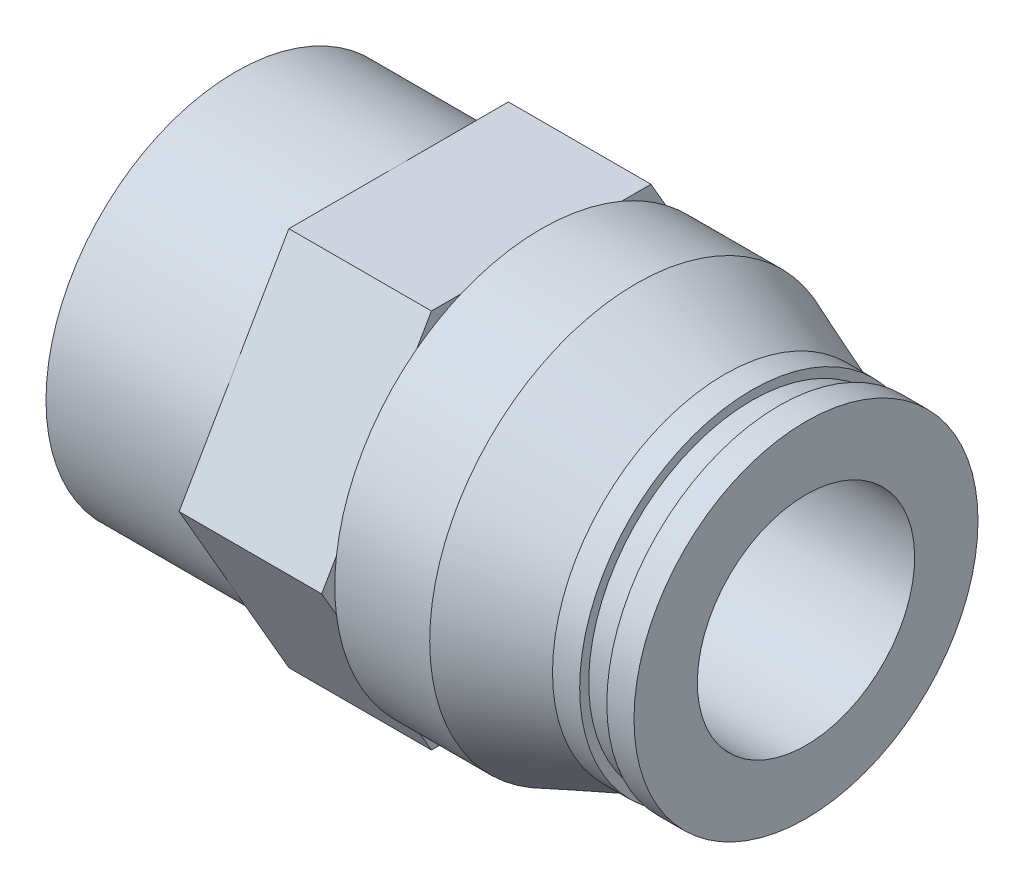
ISO-10303-21;
HEADER;
FILE_DESCRIPTION(('STEP AP214'),'2;1');
FILE_NAME('part.step','',(''),(''),'','','');
FILE_SCHEMA(('AUTOMOTIVE_DESIGN { 1 0 10303 214 1 1 1 1 }'));
ENDSEC;
DATA;
#1=APPLICATION_CONTEXT('core data for automotive mechanical design processes');
#2=APPLICATION_PROTOCOL_DEFINITION('international standard','automotive_design',2000,#1);
#3=PRODUCT_CONTEXT('',#1,'mechanical');
#4=PRODUCT('Part','Part','',(#3));
#5=PRODUCT_RELATED_PRODUCT_CATEGORY('part','',(#4));
#6=PRODUCT_DEFINITION_FORMATION('','',#4);
#7=PRODUCT_DEFINITION_CONTEXT('part definition',#1,'design');
#8=PRODUCT_DEFINITION('design','',#6,#7);
#9=PRODUCT_DEFINITION_SHAPE('','',#8);
#10=(LENGTH_UNIT() NAMED_UNIT(*) SI_UNIT(.MILLI.,.METRE.));
#11=(NAMED_UNIT(*) PLANE_ANGLE_UNIT() SI_UNIT($,.RADIAN.));
#12=(NAMED_UNIT(*) SI_UNIT($,.STERADIAN.) SOLID_ANGLE_UNIT());
#13=UNCERTAINTY_MEASURE_WITH_UNIT(LENGTH_MEASURE(1.E-05),#10,'distance_accuracy_value','');
#14=(GEOMETRIC_REPRESENTATION_CONTEXT(3) GLOBAL_UNCERTAINTY_ASSIGNED_CONTEXT((#13)) GLOBAL_UNIT_ASSIGNED_CONTEXT((#10,
#11,#12)) REPRESENTATION_CONTEXT('',''));
#15=CARTESIAN_POINT('',(0.,0.,0.));
#16=DIRECTION('',(0.,0.,1.));
#17=DIRECTION('',(1.,0.,0.));
#18=AXIS2_PLACEMENT_3D('',#15,#16,#17);
#19=CARTESIAN_POINT('',(16.875,12.5,0.));
#20=DIRECTION('',(1.,0.,0.));
#21=DIRECTION('',(0.,1.,0.));
#22=AXIS2_PLACEMENT_3D('',#19,#20,#21);
#23=PLANE('',#22);
#24=DIRECTION('',(0.,0.,1.));
#25=VECTOR('',#24,1.);
#26=CARTESIAN_POINT('',(16.875,-10.5,0.));
#27=LINE('',#26,#25);
#28=CARTESIAN_POINT('',(16.875,-10.5,6.06217782649104));
#29=VERTEX_POINT('',#28);
#30=CARTESIAN_POINT('',(16.875,-10.5,4.43299528280811));
#31=VERTEX_POINT('',#30);
#32=EDGE_CURVE('E136',#29,#31,#27,.F.);
#33=ORIENTED_EDGE('',*,*,#32,.T.);
#34=CARTESIAN_POINT('',(16.875,0.,0.));
#35=DIRECTION('',(1.,0.,0.));
#36=DIRECTION('',(0.,1.,0.));
#37=AXIS2_PLACEMENT_3D('',#34,#35,#36);
#38=CIRCLE('',#37,11.3974316044186);
#39=CARTESIAN_POINT('',(16.875,-9.08908652976844,6.87676909833253));
#40=VERTEX_POINT('',#39);
#41=EDGE_CURVE('E17',#40,#31,#38,.T.);
#42=ORIENTED_EDGE('',*,*,#41,.F.);
#43=DIRECTION('',(0.,-0.866025403784436,-0.500000000000005));
#44=VECTOR('',#43,1.);
#45=CARTESIAN_POINT('',(16.875,-9.08908652976842,6.87676909833254));
#46=LINE('',#45,#44);
#47=EDGE_CURVE('E139',#40,#29,#46,.T.);
#48=ORIENTED_EDGE('',*,*,#47,.T.);
#49=EDGE_LOOP('',(#33,#42,#48));
#50=FACE_BOUND('',#49,.T.);
#51=ADVANCED_FACE('F14',(#50),#23,.T.);
#52=CARTESIAN_POINT('',(16.875,12.5,0.));
#53=DIRECTION('',(1.,0.,0.));
#54=DIRECTION('',(0.,1.,0.));
#55=AXIS2_PLACEMENT_3D('',#52,#53,#54);
#56=PLANE('',#55);
#57=DIRECTION('',(0.,0.,1.));
#58=VECTOR('',#57,1.);
#59=CARTESIAN_POINT('',(16.875,-10.5,0.));
#60=LINE('',#59,#58);
#61=CARTESIAN_POINT('',(16.875,-10.5,-4.43299528280812));
#62=VERTEX_POINT('',#61);
#63=CARTESIAN_POINT('',(16.875,-10.5,-6.06217782649111));
#64=VERTEX_POINT('',#63);
#65=EDGE_CURVE('E144',#62,#64,#60,.F.);
#66=ORIENTED_EDGE('',*,*,#65,.T.);
#67=DIRECTION('',(0.,0.866025403784436,-0.500000000000004));
#68=VECTOR('',#67,1.);
#69=CARTESIAN_POINT('',(16.875,-10.5,-6.0621778264911));
#70=LINE('',#69,#68);
#71=CARTESIAN_POINT('',(16.875,-9.08908652976841,-6.87676909833259));
#72=VERTEX_POINT('',#71);
#73=EDGE_CURVE('E202',#64,#72,#70,.T.);
#74=ORIENTED_EDGE('',*,*,#73,.T.);
#75=CARTESIAN_POINT('',(16.875,0.,0.));
#76=DIRECTION('',(1.,0.,0.));
#77=DIRECTION('',(0.,1.,0.));
#78=AXIS2_PLACEMENT_3D('',#75,#76,#77);
#79=CIRCLE('',#78,11.3974316044186);
#80=EDGE_CURVE('E158',#62,#72,#79,.T.);
#81=ORIENTED_EDGE('',*,*,#80,.F.);
#82=EDGE_LOOP('',(#66,#74,#81));
#83=FACE_BOUND('',#82,.T.);
#84=ADVANCED_FACE('F479',(#83),#56,.T.);
#85=CARTESIAN_POINT('',(16.875,12.5,0.));
#86=DIRECTION('',(1.,0.,0.));
#87=DIRECTION('',(0.,1.,0.));
#88=AXIS2_PLACEMENT_3D('',#85,#86,#87);
#89=PLANE('',#88);
#90=DIRECTION('',(0.,0.866025403784436,0.500000000000004));
#91=VECTOR('',#90,1.);
#92=CARTESIAN_POINT('',(16.875,9.08908652976843,-6.87676909833254));
#93=LINE('',#92,#91);
#94=CARTESIAN_POINT('',(16.875,9.08908652976842,-6.87676909833254));
#95=VERTEX_POINT('',#94);
#96=CARTESIAN_POINT('',(16.875,10.5,-6.06217782649107));
#97=VERTEX_POINT('',#96);
#98=EDGE_CURVE('E198',#95,#97,#93,.T.);
#99=ORIENTED_EDGE('',*,*,#98,.T.);
#100=DIRECTION('',(0.,0.,1.));
#101=VECTOR('',#100,1.);
#102=CARTESIAN_POINT('',(16.875,10.5,0.));
#103=LINE('',#102,#101);
#104=CARTESIAN_POINT('',(16.875,10.5,-4.43299528280816));
#105=VERTEX_POINT('',#104);
#106=EDGE_CURVE('E194',#97,#105,#103,.T.);
#107=ORIENTED_EDGE('',*,*,#106,.T.);
#108=CARTESIAN_POINT('',(16.875,0.,0.));
#109=DIRECTION('',(1.,0.,0.));
#110=DIRECTION('',(0.,1.,0.));
#111=AXIS2_PLACEMENT_3D('',#108,#109,#110);
#112=CIRCLE('',#111,11.3974316044186);
#113=EDGE_CURVE('E277',#95,#105,#112,.T.);
#114=ORIENTED_EDGE('',*,*,#113,.F.);
#115=EDGE_LOOP('',(#99,#107,#114));
#116=FACE_BOUND('',#115,.T.);
#117=ADVANCED_FACE('F473',(#116),#89,.T.);
#118=CARTESIAN_POINT('',(16.875,12.5,0.));
#119=DIRECTION('',(1.,0.,0.));
#120=DIRECTION('',(0.,1.,0.));
#121=AXIS2_PLACEMENT_3D('',#118,#119,#120);
#122=PLANE('',#121);
#123=DIRECTION('',(0.,0.,1.));
#124=VECTOR('',#123,1.);
#125=CARTESIAN_POINT('',(16.875,10.5,0.));
#126=LINE('',#125,#124);
#127=CARTESIAN_POINT('',(16.875,10.5,4.43299528280813));
#128=VERTEX_POINT('',#127);
#129=CARTESIAN_POINT('',(16.875,10.5,6.06217782649107));
#130=VERTEX_POINT('',#129);
#131=EDGE_CURVE('E190',#128,#130,#126,.T.);
#132=ORIENTED_EDGE('',*,*,#131,.T.);
#133=DIRECTION('',(0.,-0.866025403784441,0.499999999999996));
#134=VECTOR('',#133,1.);
#135=CARTESIAN_POINT('',(16.875,10.5,6.06217782649107));
#136=LINE('',#135,#134);
#137=CARTESIAN_POINT('',(16.875,9.08908652976844,6.87676909833251));
#138=VERTEX_POINT('',#137);
#139=EDGE_CURVE('E159',#130,#138,#136,.T.);
#140=ORIENTED_EDGE('',*,*,#139,.T.);
#141=CARTESIAN_POINT('',(16.875,0.,0.));
#142=DIRECTION('',(1.,0.,0.));
#143=DIRECTION('',(0.,1.,0.));
#144=AXIS2_PLACEMENT_3D('',#141,#142,#143);
#145=CIRCLE('',#144,11.3974316044186);
#146=EDGE_CURVE('E188',#128,#138,#145,.T.);
#147=ORIENTED_EDGE('',*,*,#146,.F.);
#148=EDGE_LOOP('',(#132,#140,#147));
#149=FACE_BOUND('',#148,.T.);
#150=ADVANCED_FACE('F468',(#149),#122,.T.);
#151=CARTESIAN_POINT('',(0.,0.,0.));
#152=DIRECTION('',(1.,0.,0.));
#153=DIRECTION('',(0.,1.,0.));
#154=AXIS2_PLACEMENT_3D('',#151,#152,#153);
#155=CYLINDRICAL_SURFACE('',#154,11.3974316044186);
#156=CARTESIAN_POINT('',(22.1152899601702,0.,0.));
#157=DIRECTION('',(-1.,0.,0.));
#158=DIRECTION('',(0.,0.,1.));
#159=AXIS2_PLACEMENT_3D('',#156,#157,#158);
#160=CIRCLE('',#159,11.3974316044186);
#161=CARTESIAN_POINT('',(22.1152899601702,0.,11.3974316044186));
#162=VERTEX_POINT('',#161);
#163=EDGE_CURVE('E185',#162,#162,#160,.F.);
#164=ORIENTED_EDGE('',*,*,#163,.F.);
#165=EDGE_LOOP('',(#164));
#166=FACE_BOUND('',#165,.T.);
#167=ORIENTED_EDGE('',*,*,#146,.T.);
#168=CARTESIAN_POINT('',(16.875,0.,0.));
#169=DIRECTION('',(1.,0.,0.));
#170=DIRECTION('',(0.,1.,0.));
#171=AXIS2_PLACEMENT_3D('',#168,#169,#170);
#172=CIRCLE('',#171,11.3974316044186);
#173=CARTESIAN_POINT('',(16.875,1.41091347023155,11.3097643811407));
#174=VERTEX_POINT('',#173);
#175=EDGE_CURVE('E268',#174,#138,#172,.F.);
#176=ORIENTED_EDGE('',*,*,#175,.F.);
#177=CARTESIAN_POINT('',(16.875,0.,0.));
#178=DIRECTION('',(1.,0.,0.));
#179=DIRECTION('',(0.,1.,0.));
#180=AXIS2_PLACEMENT_3D('',#177,#178,#179);
#181=CIRCLE('',#180,11.3974316044186);
#182=CARTESIAN_POINT('',(16.875,-1.41091347023155,11.3097643811407));
#183=VERTEX_POINT('',#182);
#184=EDGE_CURVE('E271',#183,#174,#181,.F.);
#185=ORIENTED_EDGE('',*,*,#184,.F.);
#186=CARTESIAN_POINT('',(16.875,0.,0.));
#187=DIRECTION('',(1.,0.,0.));
#188=DIRECTION('',(0.,1.,0.));
#189=AXIS2_PLACEMENT_3D('',#186,#187,#188);
#190=CIRCLE('',#189,11.3974316044186);
#191=EDGE_CURVE('E156',#40,#183,#190,.F.);
#192=ORIENTED_EDGE('',*,*,#191,.F.);
#193=ORIENTED_EDGE('',*,*,#41,.T.);
#194=CARTESIAN_POINT('',(16.875,0.,0.));
#195=DIRECTION('',(1.,0.,0.));
#196=DIRECTION('',(0.,1.,0.));
#197=AXIS2_PLACEMENT_3D('',#194,#195,#196);
#198=CIRCLE('',#197,11.3974316044186);
#199=EDGE_CURVE('E152',#62,#31,#198,.F.);
#200=ORIENTED_EDGE('',*,*,#199,.F.);
#201=ORIENTED_EDGE('',*,*,#80,.T.);
#202=CARTESIAN_POINT('',(16.875,0.,0.));
#203=DIRECTION('',(1.,0.,0.));
#204=DIRECTION('',(0.,1.,0.));
#205=AXIS2_PLACEMENT_3D('',#202,#203,#204);
#206=CIRCLE('',#205,11.3974316044186);
#207=CARTESIAN_POINT('',(16.875,-1.41091347023158,-11.3097643811407));
#208=VERTEX_POINT('',#207);
#209=EDGE_CURVE('E163',#208,#72,#206,.F.);
#210=ORIENTED_EDGE('',*,*,#209,.F.);
#211=CARTESIAN_POINT('',(16.875,0.,0.));
#212=DIRECTION('',(1.,0.,0.));
#213=DIRECTION('',(0.,1.,0.));
#214=AXIS2_PLACEMENT_3D('',#211,#212,#213);
#215=CIRCLE('',#214,11.3974316044186);
#216=CARTESIAN_POINT('',(16.875,1.41091347023157,-11.3097643811407));
#217=VERTEX_POINT('',#216);
#218=EDGE_CURVE('E280',#208,#217,#215,.T.);
#219=ORIENTED_EDGE('',*,*,#218,.T.);
#220=CARTESIAN_POINT('',(16.875,0.,0.));
#221=DIRECTION('',(1.,0.,0.));
#222=DIRECTION('',(0.,1.,0.));
#223=AXIS2_PLACEMENT_3D('',#220,#221,#222);
#224=CIRCLE('',#223,11.3974316044186);
#225=EDGE_CURVE('E184',#95,#217,#224,.F.);
#226=ORIENTED_EDGE('',*,*,#225,.F.);
#227=ORIENTED_EDGE('',*,*,#113,.T.);
#228=CARTESIAN_POINT('',(16.875,0.,0.));
#229=DIRECTION('',(1.,0.,0.));
#230=DIRECTION('',(0.,1.,0.));
#231=AXIS2_PLACEMENT_3D('',#228,#229,#230);
#232=CIRCLE('',#231,11.3974316044186);
#233=EDGE_CURVE('E265',#128,#105,#232,.F.);
#234=ORIENTED_EDGE('',*,*,#233,.F.);
#235=EDGE_LOOP('',(#167,#176,#185,#192,#193,#200,#201,#210,#219,#226,#227,#234));
#236=FACE_BOUND('',#235,.T.);
#237=ADVANCED_FACE('F150',(#166,#236),#155,.T.);
#238=CARTESIAN_POINT('',(22.1152899601702,0.,0.));
#239=DIRECTION('',(-1.,0.,0.));
#240=DIRECTION('',(0.,-1.,0.));
#241=AXIS2_PLACEMENT_3D('',#238,#239,#240);
#242=CONICAL_SURFACE('',#241,11.3974316044186,0.370503949260779);
#243=CARTESIAN_POINT('',(27.,0.,0.));
#244=DIRECTION('',(1.,0.,0.));
#245=DIRECTION('',(0.,1.,0.));
#246=AXIS2_PLACEMENT_3D('',#243,#244,#245);
#247=CIRCLE('',#246,9.5);
#248=CARTESIAN_POINT('',(27.,9.5,0.));
#249=VERTEX_POINT('',#248);
#250=EDGE_CURVE('E181',#249,#249,#247,.T.);
#251=ORIENTED_EDGE('',*,*,#250,.F.);
#252=EDGE_LOOP('',(#251));
#253=FACE_BOUND('',#252,.T.);
#254=ORIENTED_EDGE('',*,*,#163,.T.);
#255=EDGE_LOOP('',(#254));
#256=FACE_BOUND('',#255,.T.);
#257=ADVANCED_FACE('F461',(#253,#256),#242,.T.);
#258=CARTESIAN_POINT('',(16.875,0.,0.));
#259=DIRECTION('',(-1.,0.,0.));
#260=DIRECTION('',(0.,-1.,0.));
#261=AXIS2_PLACEMENT_3D('',#258,#259,#260);
#262=PLANE('',#261);
#263=DIRECTION('',(0.,0.866025403784439,-0.5));
#264=VECTOR('',#263,1.);
#265=CARTESIAN_POINT('',(16.875,0.,-12.1243556529821));
#266=LINE('',#265,#264);
#267=EDGE_CURVE('E173',#208,#72,#266,.F.);
#268=ORIENTED_EDGE('',*,*,#267,.F.);
#269=ORIENTED_EDGE('',*,*,#209,.T.);
#270=EDGE_LOOP('',(#268,#269));
#271=FACE_BOUND('',#270,.T.);
#272=ADVANCED_FACE('F285',(#271),#262,.T.);
#273=CARTESIAN_POINT('',(16.875,0.,0.));
#274=DIRECTION('',(-1.,0.,0.));
#275=DIRECTION('',(0.,-1.,0.));
#276=AXIS2_PLACEMENT_3D('',#273,#274,#275);
#277=PLANE('',#276);
#278=DIRECTION('',(0.,0.,1.));
#279=VECTOR('',#278,1.);
#280=CARTESIAN_POINT('',(16.875,-10.5,-6.0621778264911));
#281=LINE('',#280,#279);
#282=EDGE_CURVE('E162',#62,#31,#281,.T.);
#283=ORIENTED_EDGE('',*,*,#282,.F.);
#284=ORIENTED_EDGE('',*,*,#199,.T.);
#285=EDGE_LOOP('',(#283,#284));
#286=FACE_BOUND('',#285,.T.);
#287=ADVANCED_FACE('F161',(#286),#277,.T.);
#288=CARTESIAN_POINT('',(16.875,0.,0.));
#289=DIRECTION('',(-1.,0.,0.));
#290=DIRECTION('',(0.,-1.,0.));
#291=AXIS2_PLACEMENT_3D('',#288,#289,#290);
#292=PLANE('',#291);
#293=DIRECTION('',(0.,-0.866025403784439,-0.5));
#294=VECTOR('',#293,1.);
#295=CARTESIAN_POINT('',(16.875,-10.5,6.06217782649104));
#296=LINE('',#295,#294);
#297=EDGE_CURVE('E171',#40,#183,#296,.F.);
#298=ORIENTED_EDGE('',*,*,#297,.F.);
#299=ORIENTED_EDGE('',*,*,#191,.T.);
#300=EDGE_LOOP('',(#298,#299));
#301=FACE_BOUND('',#300,.T.);
#302=ADVANCED_FACE('F504',(#301),#292,.T.);
#303=CARTESIAN_POINT('',(16.875,12.5,0.));
#304=DIRECTION('',(1.,0.,0.));
#305=DIRECTION('',(0.,1.,0.));
#306=AXIS2_PLACEMENT_3D('',#303,#304,#305);
#307=PLANE('',#306);
#308=DIRECTION('',(0.,-0.866025403784439,-0.5));
#309=VECTOR('',#308,1.);
#310=CARTESIAN_POINT('',(16.875,-10.5,6.06217782649104));
#311=LINE('',#310,#309);
#312=CARTESIAN_POINT('',(16.875,0.,12.1243556529821));
#313=VERTEX_POINT('',#312);
#314=EDGE_CURVE('E319',#183,#313,#311,.F.);
#315=ORIENTED_EDGE('',*,*,#314,.F.);
#316=ORIENTED_EDGE('',*,*,#184,.T.);
#317=DIRECTION('',(0.,-0.866025403784438,0.5));
#318=VECTOR('',#317,1.);
#319=CARTESIAN_POINT('',(16.875,0.,12.1243556529821));
#320=LINE('',#319,#318);
#321=EDGE_CURVE('E309',#313,#174,#320,.F.);
#322=ORIENTED_EDGE('',*,*,#321,.F.);
#323=EDGE_LOOP('',(#315,#316,#322));
#324=FACE_BOUND('',#323,.T.);
#325=ADVANCED_FACE('F501',(#324),#307,.T.);
#326=CARTESIAN_POINT('',(16.875,0.,0.));
#327=DIRECTION('',(-1.,0.,0.));
#328=DIRECTION('',(0.,-1.,0.));
#329=AXIS2_PLACEMENT_3D('',#326,#327,#328);
#330=PLANE('',#329);
#331=DIRECTION('',(0.,-0.866025403784438,0.5));
#332=VECTOR('',#331,1.);
#333=CARTESIAN_POINT('',(16.875,0.,12.1243556529821));
#334=LINE('',#333,#332);
#335=EDGE_CURVE('E220',#174,#138,#334,.F.);
#336=ORIENTED_EDGE('',*,*,#335,.F.);
#337=ORIENTED_EDGE('',*,*,#175,.T.);
#338=EDGE_LOOP('',(#336,#337));
#339=FACE_BOUND('',#338,.T.);
#340=ADVANCED_FACE('F364',(#339),#330,.T.);
#341=CARTESIAN_POINT('',(16.875,0.,0.));
#342=DIRECTION('',(-1.,0.,0.));
#343=DIRECTION('',(0.,-1.,0.));
#344=AXIS2_PLACEMENT_3D('',#341,#342,#343);
#345=PLANE('',#344);
#346=DIRECTION('',(0.,0.,1.));
#347=VECTOR('',#346,1.);
#348=CARTESIAN_POINT('',(16.875,10.5,6.06217782649107));
#349=LINE('',#348,#347);
#350=EDGE_CURVE('E219',#128,#105,#349,.F.);
#351=ORIENTED_EDGE('',*,*,#350,.F.);
#352=ORIENTED_EDGE('',*,*,#233,.T.);
#353=EDGE_LOOP('',(#351,#352));
#354=FACE_BOUND('',#353,.T.);
#355=ADVANCED_FACE('F355',(#354),#345,.T.);
#356=CARTESIAN_POINT('',(16.875,0.,0.));
#357=DIRECTION('',(-1.,0.,0.));
#358=DIRECTION('',(0.,-1.,0.));
#359=AXIS2_PLACEMENT_3D('',#356,#357,#358);
#360=PLANE('',#359);
#361=DIRECTION('',(0.,0.866025403784439,0.5));
#362=VECTOR('',#361,1.);
#363=CARTESIAN_POINT('',(16.875,10.5,-6.06217782649107));
#364=LINE('',#363,#362);
#365=EDGE_CURVE('E226',#95,#217,#364,.F.);
#366=ORIENTED_EDGE('',*,*,#365,.F.);
#367=ORIENTED_EDGE('',*,*,#225,.T.);
#368=EDGE_LOOP('',(#366,#367));
#369=FACE_BOUND('',#368,.T.);
#370=ADVANCED_FACE('F353',(#369),#360,.T.);
#371=CARTESIAN_POINT('',(16.875,12.5,0.));
#372=DIRECTION('',(1.,0.,0.));
#373=DIRECTION('',(0.,1.,0.));
#374=AXIS2_PLACEMENT_3D('',#371,#372,#373);
#375=PLANE('',#374);
#376=DIRECTION('',(0.,0.866025403784439,0.5));
#377=VECTOR('',#376,1.);
#378=CARTESIAN_POINT('',(16.875,10.5,-6.06217782649107));
#379=LINE('',#378,#377);
#380=CARTESIAN_POINT('',(16.875,0.,-12.1243556529821));
#381=VERTEX_POINT('',#380);
#382=EDGE_CURVE('E304',#217,#381,#379,.F.);
#383=ORIENTED_EDGE('',*,*,#382,.F.);
#384=ORIENTED_EDGE('',*,*,#218,.F.);
#385=DIRECTION('',(0.,0.866025403784439,-0.5));
#386=VECTOR('',#385,1.);
#387=CARTESIAN_POINT('',(16.875,0.,-12.1243556529821));
#388=LINE('',#387,#386);
#389=EDGE_CURVE('E180',#381,#208,#388,.F.);
#390=ORIENTED_EDGE('',*,*,#389,.F.);
#391=EDGE_LOOP('',(#383,#384,#390));
#392=FACE_BOUND('',#391,.T.);
#393=ADVANCED_FACE('F350',(#392),#375,.T.);
#394=CARTESIAN_POINT('',(0.,0.,0.));
#395=DIRECTION('',(1.,0.,0.));
#396=DIRECTION('',(0.,1.,0.));
#397=AXIS2_PLACEMENT_3D('',#394,#395,#396);
#398=CYLINDRICAL_SURFACE('',#397,9.5);
#399=ORIENTED_EDGE('',*,*,#250,.T.);
#400=EDGE_LOOP('',(#399));
#401=FACE_BOUND('',#400,.T.);
#402=CARTESIAN_POINT('',(28.5,0.,0.));
#403=DIRECTION('',(1.,0.,0.));
#404=DIRECTION('',(0.,1.,0.));
#405=AXIS2_PLACEMENT_3D('',#402,#403,#404);
#406=CIRCLE('',#405,9.5);
#407=CARTESIAN_POINT('',(28.5,9.5,0.));
#408=VERTEX_POINT('',#407);
#409=EDGE_CURVE('E258',#408,#408,#406,.T.);
#410=ORIENTED_EDGE('',*,*,#409,.F.);
#411=EDGE_LOOP('',(#410));
#412=FACE_BOUND('',#411,.T.);
#413=ADVANCED_FACE('F362',(#401,#412),#398,.T.);
#414=CARTESIAN_POINT('',(16.875,0.,-12.1243556529821));
#415=DIRECTION('',(0.,-0.5,-0.866025403784439));
#416=DIRECTION('',(0.,0.866025403784439,-0.5));
#417=AXIS2_PLACEMENT_3D('',#414,#415,#416);
#418=PLANE('',#417);
#419=DIRECTION('',(1.,0.,0.));
#420=VECTOR('',#419,1.);
#421=CARTESIAN_POINT('',(16.875,-10.5,-6.0621778264911));
#422=LINE('',#421,#420);
#423=CARTESIAN_POINT('',(9.,-10.5,-6.06217782649109));
#424=VERTEX_POINT('',#423);
#425=EDGE_CURVE('E169',#424,#64,#422,.T.);
#426=ORIENTED_EDGE('',*,*,#425,.F.);
#427=DIRECTION('',(0.,-0.86602540378444,0.499999999999998));
#428=VECTOR('',#427,1.);
#429=CARTESIAN_POINT('',(9.,0.,-12.1243556529821));
#430=LINE('',#429,#428);
#431=CARTESIAN_POINT('',(9.,0.,-12.1243556529821));
#432=VERTEX_POINT('',#431);
#433=EDGE_CURVE('E261',#432,#424,#430,.T.);
#434=ORIENTED_EDGE('',*,*,#433,.F.);
#435=DIRECTION('',(1.,0.,0.));
#436=VECTOR('',#435,1.);
#437=CARTESIAN_POINT('',(16.875,0.,-12.1243556529821));
#438=LINE('',#437,#436);
#439=EDGE_CURVE('E262',#381,#432,#438,.F.);
#440=ORIENTED_EDGE('',*,*,#439,.F.);
#441=ORIENTED_EDGE('',*,*,#389,.T.);
#442=ORIENTED_EDGE('',*,*,#267,.T.);
#443=ORIENTED_EDGE('',*,*,#73,.F.);
#444=EDGE_LOOP('',(#426,#434,#440,#441,#442,#443));
#445=FACE_BOUND('',#444,.T.);
#446=ADVANCED_FACE('F290',(#445),#418,.T.);
#447=CARTESIAN_POINT('',(16.875,-10.5,-6.0621778264911));
#448=DIRECTION('',(0.,-1.,0.));
#449=DIRECTION('',(1.,0.,0.));
#450=AXIS2_PLACEMENT_3D('',#447,#448,#449);
#451=PLANE('',#450);
#452=DIRECTION('',(1.,0.,0.));
#453=VECTOR('',#452,1.);
#454=CARTESIAN_POINT('',(16.875,-10.5,6.06217782649104));
#455=LINE('',#454,#453);
#456=CARTESIAN_POINT('',(9.,-10.5,6.06217782649104));
#457=VERTEX_POINT('',#456);
#458=EDGE_CURVE('E168',#457,#29,#455,.T.);
#459=ORIENTED_EDGE('',*,*,#458,.F.);
#460=DIRECTION('',(0.,0.,1.));
#461=VECTOR('',#460,1.);
#462=CARTESIAN_POINT('',(9.,-10.5,0.));
#463=LINE('',#462,#461);
#464=EDGE_CURVE('E328',#424,#457,#463,.T.);
#465=ORIENTED_EDGE('',*,*,#464,.F.);
#466=ORIENTED_EDGE('',*,*,#425,.T.);
#467=ORIENTED_EDGE('',*,*,#65,.F.);
#468=ORIENTED_EDGE('',*,*,#282,.T.);
#469=ORIENTED_EDGE('',*,*,#32,.F.);
#470=EDGE_LOOP('',(#459,#465,#466,#467,#468,#469));
#471=FACE_BOUND('',#470,.T.);
#472=ADVANCED_FACE('F165',(#471),#451,.T.);
#473=CARTESIAN_POINT('',(16.875,-10.5,6.06217782649104));
#474=DIRECTION('',(0.,-0.5,0.866025403784439));
#475=DIRECTION('',(0.,-0.866025403784439,-0.5));
#476=AXIS2_PLACEMENT_3D('',#473,#474,#475);
#477=PLANE('',#476);
#478=DIRECTION('',(1.,0.,0.));
#479=VECTOR('',#478,1.);
#480=CARTESIAN_POINT('',(16.875,0.,12.1243556529821));
#481=LINE('',#480,#479);
#482=CARTESIAN_POINT('',(9.,0.,12.1243556529821));
#483=VERTEX_POINT('',#482);
#484=EDGE_CURVE('E312',#483,#313,#481,.T.);
#485=ORIENTED_EDGE('',*,*,#484,.F.);
#486=DIRECTION('',(0.,0.866025403784439,0.499999999999999));
#487=VECTOR('',#486,1.);
#488=CARTESIAN_POINT('',(9.,-10.5,6.06217782649104));
#489=LINE('',#488,#487);
#490=EDGE_CURVE('E325',#457,#483,#489,.T.);
#491=ORIENTED_EDGE('',*,*,#490,.F.);
#492=ORIENTED_EDGE('',*,*,#458,.T.);
#493=ORIENTED_EDGE('',*,*,#47,.F.);
#494=ORIENTED_EDGE('',*,*,#297,.T.);
#495=ORIENTED_EDGE('',*,*,#314,.T.);
#496=EDGE_LOOP('',(#485,#491,#492,#493,#494,#495));
#497=FACE_BOUND('',#496,.T.);
#498=ADVANCED_FACE('F443',(#497),#477,.T.);
#499=CARTESIAN_POINT('',(16.875,0.,12.1243556529821));
#500=DIRECTION('',(0.,0.5,0.866025403784438));
#501=DIRECTION('',(0.,-0.866025403784438,0.5));
#502=AXIS2_PLACEMENT_3D('',#499,#500,#501);
#503=PLANE('',#502);
#504=DIRECTION('',(-1.,0.,0.));
#505=VECTOR('',#504,1.);
#506=CARTESIAN_POINT('',(16.875,10.5,6.06217782649107));
#507=LINE('',#506,#505);
#508=CARTESIAN_POINT('',(9.,10.5,6.06217782649106));
#509=VERTEX_POINT('',#508);
#510=EDGE_CURVE('E216',#509,#130,#507,.F.);
#511=ORIENTED_EDGE('',*,*,#510,.F.);
#512=DIRECTION('',(0.,0.866025403784439,-0.499999999999998));
#513=VECTOR('',#512,1.);
#514=CARTESIAN_POINT('',(9.,0.,12.1243556529821));
#515=LINE('',#514,#513);
#516=EDGE_CURVE('E327',#483,#509,#515,.T.);
#517=ORIENTED_EDGE('',*,*,#516,.F.);
#518=ORIENTED_EDGE('',*,*,#484,.T.);
#519=ORIENTED_EDGE('',*,*,#321,.T.);
#520=ORIENTED_EDGE('',*,*,#335,.T.);
#521=ORIENTED_EDGE('',*,*,#139,.F.);
#522=EDGE_LOOP('',(#511,#517,#518,#519,#520,#521));
#523=FACE_BOUND('',#522,.T.);
#524=ADVANCED_FACE('F439',(#523),#503,.T.);
#525=CARTESIAN_POINT('',(16.875,10.5,6.06217782649107));
#526=DIRECTION('',(0.,1.,0.));
#527=DIRECTION('',(-1.,0.,0.));
#528=AXIS2_PLACEMENT_3D('',#525,#526,#527);
#529=PLANE('',#528);
#530=DIRECTION('',(1.,0.,0.));
#531=VECTOR('',#530,1.);
#532=CARTESIAN_POINT('',(16.875,10.5,-6.06217782649107));
#533=LINE('',#532,#531);
#534=CARTESIAN_POINT('',(9.,10.5,-6.06217782649107));
#535=VERTEX_POINT('',#534);
#536=EDGE_CURVE('E223',#535,#97,#533,.T.);
#537=ORIENTED_EDGE('',*,*,#536,.F.);
#538=DIRECTION('',(0.,0.,1.));
#539=VECTOR('',#538,1.);
#540=CARTESIAN_POINT('',(9.,10.5,0.));
#541=LINE('',#540,#539);
#542=EDGE_CURVE('E331',#509,#535,#541,.F.);
#543=ORIENTED_EDGE('',*,*,#542,.F.);
#544=ORIENTED_EDGE('',*,*,#510,.T.);
#545=ORIENTED_EDGE('',*,*,#131,.F.);
#546=ORIENTED_EDGE('',*,*,#350,.T.);
#547=ORIENTED_EDGE('',*,*,#106,.F.);
#548=EDGE_LOOP('',(#537,#543,#544,#545,#546,#547));
#549=FACE_BOUND('',#548,.T.);
#550=ADVANCED_FACE('F436',(#549),#529,.T.);
#551=CARTESIAN_POINT('',(16.875,10.5,-6.06217782649107));
#552=DIRECTION('',(0.,0.5,-0.866025403784439));
#553=DIRECTION('',(0.,0.866025403784439,0.5));
#554=AXIS2_PLACEMENT_3D('',#551,#552,#553);
#555=PLANE('',#554);
#556=ORIENTED_EDGE('',*,*,#439,.T.);
#557=DIRECTION('',(0.,-0.866025403784439,-0.5));
#558=VECTOR('',#557,1.);
#559=CARTESIAN_POINT('',(9.,10.5,-6.06217782649107));
#560=LINE('',#559,#558);
#561=EDGE_CURVE('E257',#535,#432,#560,.T.);
#562=ORIENTED_EDGE('',*,*,#561,.F.);
#563=ORIENTED_EDGE('',*,*,#536,.T.);
#564=ORIENTED_EDGE('',*,*,#98,.F.);
#565=ORIENTED_EDGE('',*,*,#365,.T.);
#566=ORIENTED_EDGE('',*,*,#382,.T.);
#567=EDGE_LOOP('',(#556,#562,#563,#564,#565,#566));
#568=FACE_BOUND('',#567,.T.);
#569=ADVANCED_FACE('F347',(#568),#555,.T.);
#570=CARTESIAN_POINT('',(28.5,9.49999999999995,0.));
#571=DIRECTION('',(1.,0.,0.));
#572=DIRECTION('',(0.,1.,0.));
#573=AXIS2_PLACEMENT_3D('',#570,#571,#572);
#574=PLANE('',#573);
#575=CARTESIAN_POINT('',(28.5,0.,0.));
#576=DIRECTION('',(1.,0.,0.));
#577=DIRECTION('',(0.,1.,0.));
#578=AXIS2_PLACEMENT_3D('',#575,#576,#577);
#579=CIRCLE('',#578,9.);
#580=CARTESIAN_POINT('',(28.5,9.,0.));
#581=VERTEX_POINT('',#580);
#582=EDGE_CURVE('E254',#581,#581,#579,.T.);
#583=ORIENTED_EDGE('',*,*,#582,.F.);
#584=EDGE_LOOP('',(#583));
#585=FACE_BOUND('',#584,.T.);
#586=ORIENTED_EDGE('',*,*,#409,.T.);
#587=EDGE_LOOP('',(#586));
#588=FACE_BOUND('',#587,.T.);
#589=ADVANCED_FACE('F430',(#585,#588),#574,.T.);
#590=CARTESIAN_POINT('',(9.,10.475,0.));
#591=DIRECTION('',(-1.,0.,0.));
#592=DIRECTION('',(0.,-1.,0.));
#593=AXIS2_PLACEMENT_3D('',#590,#591,#592);
#594=PLANE('',#593);
#595=ORIENTED_EDGE('',*,*,#542,.T.);
#596=ORIENTED_EDGE('',*,*,#561,.T.);
#597=ORIENTED_EDGE('',*,*,#433,.T.);
#598=ORIENTED_EDGE('',*,*,#464,.T.);
#599=ORIENTED_EDGE('',*,*,#490,.T.);
#600=ORIENTED_EDGE('',*,*,#516,.T.);
#601=EDGE_LOOP('',(#595,#596,#597,#598,#599,#600));
#602=FACE_BOUND('',#601,.T.);
#603=CARTESIAN_POINT('',(9.,0.,0.));
#604=DIRECTION('',(1.,0.,0.));
#605=DIRECTION('',(0.,1.,0.));
#606=AXIS2_PLACEMENT_3D('',#603,#604,#605);
#607=CIRCLE('',#606,10.475);
#608=CARTESIAN_POINT('',(9.00000000000001,10.475,0.));
#609=VERTEX_POINT('',#608);
#610=EDGE_CURVE('E251',#609,#609,#607,.F.);
#611=ORIENTED_EDGE('',*,*,#610,.F.);
#612=EDGE_LOOP('',(#611));
#613=FACE_BOUND('',#612,.T.);
#614=ADVANCED_FACE('F426',(#602,#613),#594,.T.);
#615=CARTESIAN_POINT('',(0.,0.,0.));
#616=DIRECTION('',(1.,0.,0.));
#617=DIRECTION('',(0.,1.,0.));
#618=AXIS2_PLACEMENT_3D('',#615,#616,#617);
#619=CYLINDRICAL_SURFACE('',#618,9.);
#620=ORIENTED_EDGE('',*,*,#582,.T.);
#621=EDGE_LOOP('',(#620));
#622=FACE_BOUND('',#621,.T.);
#623=CARTESIAN_POINT('',(30.,0.,0.));
#624=DIRECTION('',(1.,0.,0.));
#625=DIRECTION('',(0.,1.,0.));
#626=AXIS2_PLACEMENT_3D('',#623,#624,#625);
#627=CIRCLE('',#626,9.);
#628=CARTESIAN_POINT('',(30.,9.,0.));
#629=VERTEX_POINT('',#628);
#630=EDGE_CURVE('E248',#629,#629,#627,.T.);
#631=ORIENTED_EDGE('',*,*,#630,.F.);
#632=EDGE_LOOP('',(#631));
#633=FACE_BOUND('',#632,.T.);
#634=ADVANCED_FACE('F422',(#622,#633),#619,.T.);
#635=CARTESIAN_POINT('',(0.,0.,0.));
#636=DIRECTION('',(1.,0.,0.));
#637=DIRECTION('',(0.,1.,0.));
#638=AXIS2_PLACEMENT_3D('',#635,#636,#637);
#639=CYLINDRICAL_SURFACE('',#638,10.475);
#640=CARTESIAN_POINT('',(0.,0.,0.));
#641=DIRECTION('',(1.,0.,0.));
#642=DIRECTION('',(0.,1.,0.));
#643=AXIS2_PLACEMENT_3D('',#640,#641,#642);
#644=CIRCLE('',#643,10.475);
#645=CARTESIAN_POINT('',(0.,10.475,0.));
#646=VERTEX_POINT('',#645);
#647=EDGE_CURVE('E245',#646,#646,#644,.F.);
#648=ORIENTED_EDGE('',*,*,#647,.F.);
#649=EDGE_LOOP('',(#648));
#650=FACE_BOUND('',#649,.T.);
#651=ORIENTED_EDGE('',*,*,#610,.T.);
#652=EDGE_LOOP('',(#651));
#653=FACE_BOUND('',#652,.T.);
#654=ADVANCED_FACE('F418',(#650,#653),#639,.T.);
#655=CARTESIAN_POINT('',(30.,9.00000000000001,0.));
#656=DIRECTION('',(-1.,0.,0.));
#657=DIRECTION('',(0.,-1.,0.));
#658=AXIS2_PLACEMENT_3D('',#655,#656,#657);
#659=PLANE('',#658);
#660=CARTESIAN_POINT('',(30.,0.,0.));
#661=DIRECTION('',(1.,0.,0.));
#662=DIRECTION('',(0.,1.,0.));
#663=AXIS2_PLACEMENT_3D('',#660,#661,#662);
#664=CIRCLE('',#663,9.5);
#665=CARTESIAN_POINT('',(30.,9.5,0.));
#666=VERTEX_POINT('',#665);
#667=EDGE_CURVE('E241',#666,#666,#664,.T.);
#668=ORIENTED_EDGE('',*,*,#667,.F.);
#669=EDGE_LOOP('',(#668));
#670=FACE_BOUND('',#669,.T.);
#671=ORIENTED_EDGE('',*,*,#630,.T.);
#672=EDGE_LOOP('',(#671));
#673=FACE_BOUND('',#672,.T.);
#674=ADVANCED_FACE('F414',(#670,#673),#659,.T.);
#675=CARTESIAN_POINT('',(0.,0.,0.));
#676=DIRECTION('',(-1.,0.,0.));
#677=DIRECTION('',(0.,-1.,0.));
#678=AXIS2_PLACEMENT_3D('',#675,#676,#677);
#679=PLANE('',#678);
#680=DIRECTION('',(0.,0.,-1.));
#681=VECTOR('',#680,1.);
#682=CARTESIAN_POINT('',(0.,3.99999999999999,-2.30940107675853));
#683=LINE('',#682,#681);
#684=CARTESIAN_POINT('',(0.,3.99999999999999,2.3094010767585));
#685=VERTEX_POINT('',#684);
#686=CARTESIAN_POINT('',(0.,3.99999999999998,-2.30940107675853));
#687=VERTEX_POINT('',#686);
#688=EDGE_CURVE('E791',#685,#687,#683,.T.);
#689=ORIENTED_EDGE('',*,*,#688,.F.);
#690=DIRECTION('',(0.,0.866025403784439,-0.5));
#691=VECTOR('',#690,1.);
#692=CARTESIAN_POINT('',(0.,3.99999999999999,2.3094010767585));
#693=LINE('',#692,#691);
#694=CARTESIAN_POINT('',(0.,0.,4.61880215351699));
#695=VERTEX_POINT('',#694);
#696=EDGE_CURVE('E793',#695,#685,#693,.T.);
#697=ORIENTED_EDGE('',*,*,#696,.F.);
#698=DIRECTION('',(0.,0.866025403784439,0.5));
#699=VECTOR('',#698,1.);
#700=CARTESIAN_POINT('',(0.,0.,4.61880215351698));
#701=LINE('',#700,#699);
#702=CARTESIAN_POINT('',(0.,-4.00000000000002,2.3094010767585));
#703=VERTEX_POINT('',#702);
#704=EDGE_CURVE('E809',#703,#695,#701,.T.);
#705=ORIENTED_EDGE('',*,*,#704,.F.);
#706=DIRECTION('',(0.,0.,1.));
#707=VECTOR('',#706,1.);
#708=CARTESIAN_POINT('',(0.,-4.00000000000002,2.3094010767585));
#709=LINE('',#708,#707);
#710=CARTESIAN_POINT('',(0.,-4.00000000000001,-2.30940107675853));
#711=VERTEX_POINT('',#710);
#712=EDGE_CURVE('E814',#711,#703,#709,.T.);
#713=ORIENTED_EDGE('',*,*,#712,.F.);
#714=DIRECTION('',(0.,-0.866025403784438,0.5));
#715=VECTOR('',#714,1.);
#716=CARTESIAN_POINT('',(0.,-4.,-2.30940107675853));
#717=LINE('',#716,#715);
#718=CARTESIAN_POINT('',(0.,0.,-4.61880215351701));
#719=VERTEX_POINT('',#718);
#720=EDGE_CURVE('E244',#719,#711,#717,.T.);
#721=ORIENTED_EDGE('',*,*,#720,.F.);
#722=DIRECTION('',(0.,-0.866025403784439,-0.5));
#723=VECTOR('',#722,1.);
#724=CARTESIAN_POINT('',(0.,0.,-4.61880215351701));
#725=LINE('',#724,#723);
#726=EDGE_CURVE('E795',#687,#719,#725,.T.);
#727=ORIENTED_EDGE('',*,*,#726,.F.);
#728=EDGE_LOOP('',(#689,#697,#705,#713,#721,#727));
#729=FACE_BOUND('',#728,.T.);
#730=ORIENTED_EDGE('',*,*,#647,.T.);
#731=EDGE_LOOP('',(#730));
#732=FACE_BOUND('',#731,.T.);
#733=ADVANCED_FACE('F410',(#729,#732),#679,.T.);
#734=CARTESIAN_POINT('',(0.,0.,0.));
#735=DIRECTION('',(1.,0.,0.));
#736=DIRECTION('',(0.,1.,0.));
#737=AXIS2_PLACEMENT_3D('',#734,#735,#736);
#738=CYLINDRICAL_SURFACE('',#737,9.5);
#739=ORIENTED_EDGE('',*,*,#667,.T.);
#740=EDGE_LOOP('',(#739));
#741=FACE_BOUND('',#740,.T.);
#742=CARTESIAN_POINT('',(31.5,0.,0.));
#743=DIRECTION('',(1.,0.,0.));
#744=DIRECTION('',(0.,1.,0.));
#745=AXIS2_PLACEMENT_3D('',#742,#743,#744);
#746=CIRCLE('',#745,9.5);
#747=CARTESIAN_POINT('',(31.5,9.5,0.));
#748=VERTEX_POINT('',#747);
#749=EDGE_CURVE('E236',#748,#748,#746,.T.);
#750=ORIENTED_EDGE('',*,*,#749,.F.);
#751=EDGE_LOOP('',(#750));
#752=FACE_BOUND('',#751,.T.);
#753=ADVANCED_FACE('F406',(#741,#752),#738,.T.);
#754=CARTESIAN_POINT('',(31.5,-4.,-2.30940107675853));
#755=DIRECTION('',(0.,0.5,0.866025403784438));
#756=DIRECTION('',(0.,-0.866025403784438,0.5));
#757=AXIS2_PLACEMENT_3D('',#754,#755,#756);
#758=PLANE('',#757);
#759=DIRECTION('',(-1.,0.,0.));
#760=VECTOR('',#759,1.);
#761=CARTESIAN_POINT('',(31.5,-4.00000000000002,-2.30940107675853));
#762=LINE('',#761,#760);
#763=CARTESIAN_POINT('',(10.5,-4.00000000000001,-2.30940107675853));
#764=VERTEX_POINT('',#763);
#765=EDGE_CURVE('E816',#764,#711,#762,.T.);
#766=ORIENTED_EDGE('',*,*,#765,.F.);
#767=DIRECTION('',(0.,-0.866025403784441,0.499999999999997));
#768=VECTOR('',#767,1.);
#769=CARTESIAN_POINT('',(10.5,0.,-4.61880215351701));
#770=LINE('',#769,#768);
#771=CARTESIAN_POINT('',(10.5,0.,-4.61880215351702));
#772=VERTEX_POINT('',#771);
#773=EDGE_CURVE('E239',#772,#764,#770,.T.);
#774=ORIENTED_EDGE('',*,*,#773,.F.);
#775=DIRECTION('',(1.,0.,0.));
#776=VECTOR('',#775,1.);
#777=CARTESIAN_POINT('',(31.5,0.,-4.61880215351701));
#778=LINE('',#777,#776);
#779=EDGE_CURVE('E240',#719,#772,#778,.T.);
#780=ORIENTED_EDGE('',*,*,#779,.F.);
#781=ORIENTED_EDGE('',*,*,#720,.T.);
#782=EDGE_LOOP('',(#766,#774,#780,#781));
#783=FACE_BOUND('',#782,.T.);
#784=ADVANCED_FACE('F402',(#783),#758,.T.);
#785=CARTESIAN_POINT('',(31.5,-4.00000000000002,2.3094010767585));
#786=DIRECTION('',(0.,1.,0.));
#787=DIRECTION('',(-1.,0.,0.));
#788=AXIS2_PLACEMENT_3D('',#785,#786,#787);
#789=PLANE('',#788);
#790=DIRECTION('',(1.,0.,0.));
#791=VECTOR('',#790,1.);
#792=CARTESIAN_POINT('',(31.5,-4.00000000000001,2.30940107675849));
#793=LINE('',#792,#791);
#794=CARTESIAN_POINT('',(10.5,-4.00000000000001,2.3094010767585));
#795=VERTEX_POINT('',#794);
#796=EDGE_CURVE('E811',#795,#703,#793,.F.);
#797=ORIENTED_EDGE('',*,*,#796,.F.);
#798=DIRECTION('',(0.,0.,1.));
#799=VECTOR('',#798,1.);
#800=CARTESIAN_POINT('',(10.5,-4.,0.));
#801=LINE('',#800,#799);
#802=EDGE_CURVE('E824',#764,#795,#801,.T.);
#803=ORIENTED_EDGE('',*,*,#802,.F.);
#804=ORIENTED_EDGE('',*,*,#765,.T.);
#805=ORIENTED_EDGE('',*,*,#712,.T.);
#806=EDGE_LOOP('',(#797,#803,#804,#805));
#807=FACE_BOUND('',#806,.T.);
#808=ADVANCED_FACE('F398',(#807),#789,.T.);
#809=CARTESIAN_POINT('',(31.5,0.,4.61880215351698));
#810=DIRECTION('',(0.,0.5,-0.866025403784439));
#811=DIRECTION('',(0.,0.866025403784439,0.5));
#812=AXIS2_PLACEMENT_3D('',#809,#810,#811);
#813=PLANE('',#812);
#814=DIRECTION('',(1.,0.,0.));
#815=VECTOR('',#814,1.);
#816=CARTESIAN_POINT('',(31.5,0.,4.618802153517));
#817=LINE('',#816,#815);
#818=CARTESIAN_POINT('',(10.5,0.,4.61880215351699));
#819=VERTEX_POINT('',#818);
#820=EDGE_CURVE('E806',#819,#695,#817,.F.);
#821=ORIENTED_EDGE('',*,*,#820,.F.);
#822=DIRECTION('',(0.,0.866025403784441,0.499999999999996));
#823=VECTOR('',#822,1.);
#824=CARTESIAN_POINT('',(10.5,-4.00000000000002,2.3094010767585));
#825=LINE('',#824,#823);
#826=EDGE_CURVE('E830',#795,#819,#825,.T.);
#827=ORIENTED_EDGE('',*,*,#826,.F.);
#828=ORIENTED_EDGE('',*,*,#796,.T.);
#829=ORIENTED_EDGE('',*,*,#704,.T.);
#830=EDGE_LOOP('',(#821,#827,#828,#829));
#831=FACE_BOUND('',#830,.T.);
#832=ADVANCED_FACE('F394',(#831),#813,.T.);
#833=CARTESIAN_POINT('',(31.5,3.99999999999999,2.3094010767585));
#834=DIRECTION('',(0.,-0.5,-0.866025403784439));
#835=DIRECTION('',(0.,0.866025403784439,-0.5));
#836=AXIS2_PLACEMENT_3D('',#833,#834,#835);
#837=PLANE('',#836);
#838=DIRECTION('',(1.,0.,0.));
#839=VECTOR('',#838,1.);
#840=CARTESIAN_POINT('',(31.5,3.99999999999999,2.3094010767585));
#841=LINE('',#840,#839);
#842=CARTESIAN_POINT('',(10.5,3.99999999999999,2.3094010767585));
#843=VERTEX_POINT('',#842);
#844=EDGE_CURVE('E799',#843,#685,#841,.F.);
#845=ORIENTED_EDGE('',*,*,#844,.F.);
#846=DIRECTION('',(0.,0.866025403784441,-0.499999999999996));
#847=VECTOR('',#846,1.);
#848=CARTESIAN_POINT('',(10.5,0.,4.61880215351698));
#849=LINE('',#848,#847);
#850=EDGE_CURVE('E829',#819,#843,#849,.T.);
#851=ORIENTED_EDGE('',*,*,#850,.F.);
#852=ORIENTED_EDGE('',*,*,#820,.T.);
#853=ORIENTED_EDGE('',*,*,#696,.T.);
#854=EDGE_LOOP('',(#845,#851,#852,#853));
#855=FACE_BOUND('',#854,.T.);
#856=ADVANCED_FACE('F390',(#855),#837,.T.);
#857=CARTESIAN_POINT('',(31.5,3.99999999999999,-2.30940107675853));
#858=DIRECTION('',(0.,-1.,0.));
#859=DIRECTION('',(0.,0.,-1.));
#860=AXIS2_PLACEMENT_3D('',#857,#858,#859);
#861=PLANE('',#860);
#862=DIRECTION('',(1.,0.,0.));
#863=VECTOR('',#862,1.);
#864=CARTESIAN_POINT('',(31.5,3.99999999999998,-2.30940107675851));
#865=LINE('',#864,#863);
#866=CARTESIAN_POINT('',(10.5,3.99999999999999,-2.30940107675853));
#867=VERTEX_POINT('',#866);
#868=EDGE_CURVE('E798',#867,#687,#865,.F.);
#869=ORIENTED_EDGE('',*,*,#868,.F.);
#870=DIRECTION('',(0.,0.,1.));
#871=VECTOR('',#870,1.);
#872=CARTESIAN_POINT('',(10.5,3.99999999999999,0.));
#873=LINE('',#872,#871);
#874=EDGE_CURVE('E32',#843,#867,#873,.F.);
#875=ORIENTED_EDGE('',*,*,#874,.F.);
#876=ORIENTED_EDGE('',*,*,#844,.T.);
#877=ORIENTED_EDGE('',*,*,#688,.T.);
#878=EDGE_LOOP('',(#869,#875,#876,#877));
#879=FACE_BOUND('',#878,.T.);
#880=ADVANCED_FACE('F386',(#879),#861,.T.);
#881=CARTESIAN_POINT('',(31.5,0.,-4.61880215351701));
#882=DIRECTION('',(0.,-0.5,0.866025403784439));
#883=DIRECTION('',(0.,-0.866025403784439,-0.5));
#884=AXIS2_PLACEMENT_3D('',#881,#882,#883);
#885=PLANE('',#884);
#886=ORIENTED_EDGE('',*,*,#779,.T.);
#887=DIRECTION('',(0.,-0.866025403784441,-0.499999999999996));
#888=VECTOR('',#887,1.);
#889=CARTESIAN_POINT('',(10.5,3.99999999999999,-2.30940107675853));
#890=LINE('',#889,#888);
#891=EDGE_CURVE('E235',#867,#772,#890,.T.);
#892=ORIENTED_EDGE('',*,*,#891,.F.);
#893=ORIENTED_EDGE('',*,*,#868,.T.);
#894=ORIENTED_EDGE('',*,*,#726,.T.);
#895=EDGE_LOOP('',(#886,#892,#893,#894));
#896=FACE_BOUND('',#895,.T.);
#897=ADVANCED_FACE('F382',(#896),#885,.T.);
#898=CARTESIAN_POINT('',(31.5,9.49999999999995,0.));
#899=DIRECTION('',(1.,0.,0.));
#900=DIRECTION('',(0.,1.,0.));
#901=AXIS2_PLACEMENT_3D('',#898,#899,#900);
#902=PLANE('',#901);
#903=CARTESIAN_POINT('',(31.5,0.,0.));
#904=DIRECTION('',(1.,0.,0.));
#905=DIRECTION('',(0.,1.,0.));
#906=AXIS2_PLACEMENT_3D('',#903,#904,#905);
#907=CIRCLE('',#906,6.);
#908=CARTESIAN_POINT('',(31.5,6.,0.));
#909=VERTEX_POINT('',#908);
#910=EDGE_CURVE('E23',#909,#909,#907,.F.);
#911=ORIENTED_EDGE('',*,*,#910,.T.);
#912=EDGE_LOOP('',(#911));
#913=FACE_BOUND('',#912,.T.);
#914=ORIENTED_EDGE('',*,*,#749,.T.);
#915=EDGE_LOOP('',(#914));
#916=FACE_BOUND('',#915,.T.);
#917=ADVANCED_FACE('F375',(#913,#916),#902,.T.);
#918=CARTESIAN_POINT('',(10.5,5.99999999999999,0.));
#919=DIRECTION('',(1.,0.,0.));
#920=DIRECTION('',(0.,1.,0.));
#921=AXIS2_PLACEMENT_3D('',#918,#919,#920);
#922=PLANE('',#921);
#923=ORIENTED_EDGE('',*,*,#874,.T.);
#924=ORIENTED_EDGE('',*,*,#891,.T.);
#925=ORIENTED_EDGE('',*,*,#773,.T.);
#926=ORIENTED_EDGE('',*,*,#802,.T.);
#927=ORIENTED_EDGE('',*,*,#826,.T.);
#928=ORIENTED_EDGE('',*,*,#850,.T.);
#929=EDGE_LOOP('',(#923,#924,#925,#926,#927,#928));
#930=FACE_BOUND('',#929,.T.);
#931=CARTESIAN_POINT('',(10.5,0.,0.));
#932=DIRECTION('',(1.,0.,0.));
#933=DIRECTION('',(0.,1.,0.));
#934=AXIS2_PLACEMENT_3D('',#931,#932,#933);
#935=CIRCLE('',#934,6.);
#936=CARTESIAN_POINT('',(10.5,6.,0.));
#937=VERTEX_POINT('',#936);
#938=EDGE_CURVE('E9',#937,#937,#935,.T.);
#939=ORIENTED_EDGE('',*,*,#938,.T.);
#940=EDGE_LOOP('',(#939));
#941=FACE_BOUND('',#940,.T.);
#942=ADVANCED_FACE('F369',(#930,#941),#922,.T.);
#943=CARTESIAN_POINT('',(0.,0.,0.));
#944=DIRECTION('',(1.,0.,0.));
#945=DIRECTION('',(0.,1.,0.));
#946=AXIS2_PLACEMENT_3D('',#943,#944,#945);
#947=CYLINDRICAL_SURFACE('',#946,6.);
#948=ORIENTED_EDGE('',*,*,#910,.F.);
#949=EDGE_LOOP('',(#948));
#950=FACE_BOUND('',#949,.T.);
#951=ORIENTED_EDGE('',*,*,#938,.F.);
#952=EDGE_LOOP('',(#951));
#953=FACE_BOUND('',#952,.T.);
#954=ADVANCED_FACE('F367',(#950,#953),#947,.F.);
#955=CLOSED_SHELL('',(#51,#84,#117,#150,#237,#257,#272,#287,#302,#325,#340,#355,#370,#393,#413,
#446,#472,#498,#524,#550,#569,#589,#614,#634,#654,#674,#733,#753,#784,#808,#832,#856,#880,#897,
#917,#942,#954));
#956=MANIFOLD_SOLID_BREP('B1',#955);
#957=ADVANCED_BREP_SHAPE_REPRESENTATION('',(#18,#956),#14);
#958=SHAPE_DEFINITION_REPRESENTATION(#9,#957);
ENDSEC;
END-ISO-10303-21;
